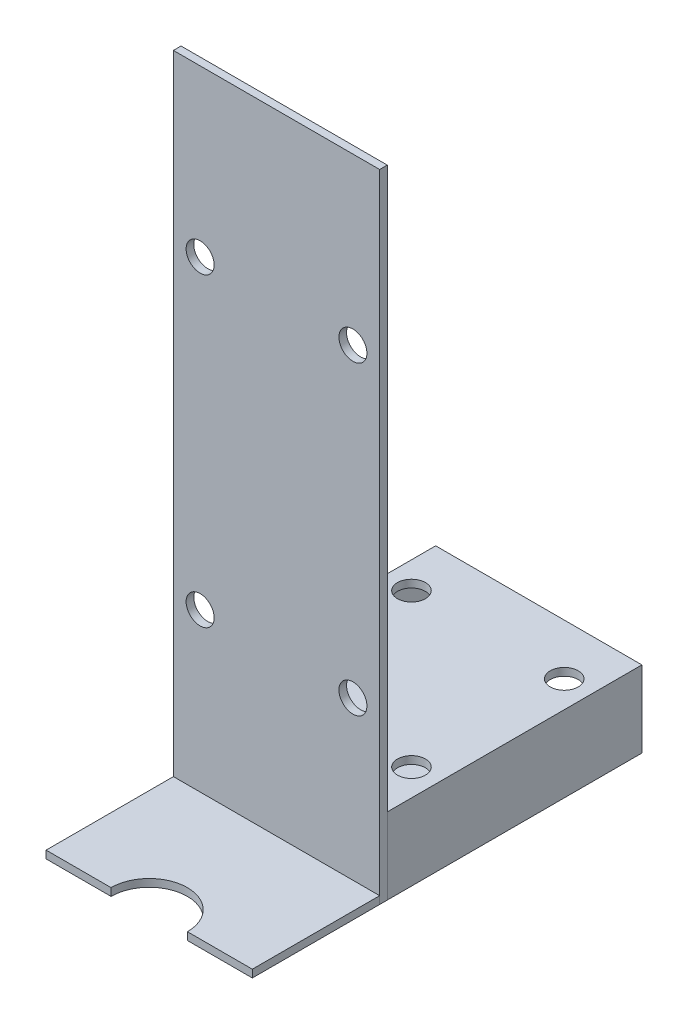
ISO-10303-21;
HEADER;
FILE_DESCRIPTION(('STEP AP214'),'2;1');
FILE_NAME('part.step','',(''),(''),'','','');
FILE_SCHEMA(('AUTOMOTIVE_DESIGN { 1 0 10303 214 1 1 1 1 }'));
ENDSEC;
DATA;
#1=APPLICATION_CONTEXT('core data for automotive mechanical design processes');
#2=APPLICATION_PROTOCOL_DEFINITION('international standard','automotive_design',2000,#1);
#3=PRODUCT_CONTEXT('',#1,'mechanical');
#4=PRODUCT('Part','Part','',(#3));
#5=PRODUCT_RELATED_PRODUCT_CATEGORY('part','',(#4));
#6=PRODUCT_DEFINITION_FORMATION('','',#4);
#7=PRODUCT_DEFINITION_CONTEXT('part definition',#1,'design');
#8=PRODUCT_DEFINITION('design','',#6,#7);
#9=PRODUCT_DEFINITION_SHAPE('','',#8);
#10=(LENGTH_UNIT() NAMED_UNIT(*) SI_UNIT(.MILLI.,.METRE.));
#11=(NAMED_UNIT(*) PLANE_ANGLE_UNIT() SI_UNIT($,.RADIAN.));
#12=(NAMED_UNIT(*) SI_UNIT($,.STERADIAN.) SOLID_ANGLE_UNIT());
#13=UNCERTAINTY_MEASURE_WITH_UNIT(LENGTH_MEASURE(1.E-05),#10,'distance_accuracy_value','');
#14=(GEOMETRIC_REPRESENTATION_CONTEXT(3) GLOBAL_UNCERTAINTY_ASSIGNED_CONTEXT((#13)) GLOBAL_UNIT_ASSIGNED_CONTEXT((#10,
#11,#12)) REPRESENTATION_CONTEXT('',''));
#15=CARTESIAN_POINT('',(0.,0.,0.));
#16=DIRECTION('',(0.,0.,1.));
#17=DIRECTION('',(1.,0.,0.));
#18=AXIS2_PLACEMENT_3D('',#15,#16,#17);
#19=CARTESIAN_POINT('',(0.,0.,76.5));
#20=DIRECTION('',(0.,0.,-1.));
#21=DIRECTION('',(-1.,0.,0.));
#22=AXIS2_PLACEMENT_3D('',#19,#20,#21);
#23=PLANE('',#22);
#24=DIRECTION('',(-1.,0.,0.));
#25=VECTOR('',#24,1.);
#26=CARTESIAN_POINT('',(-1.49999999999999,0.,76.5));
#27=LINE('',#26,#25);
#28=CARTESIAN_POINT('',(39.,0.,76.5));
#29=VERTEX_POINT('',#28);
#30=CARTESIAN_POINT('',(26.25,0.,76.5));
#31=VERTEX_POINT('',#30);
#32=EDGE_CURVE('E145',#29,#31,#27,.T.);
#33=ORIENTED_EDGE('',*,*,#32,.T.);
#34=DIRECTION('',(0.,-1.,0.));
#35=VECTOR('',#34,1.);
#36=CARTESIAN_POINT('',(26.25,23.5,76.5));
#37=LINE('',#36,#35);
#38=CARTESIAN_POINT('',(26.25,-1.5,76.5));
#39=VERTEX_POINT('',#38);
#40=EDGE_CURVE('E13',#31,#39,#37,.T.);
#41=ORIENTED_EDGE('',*,*,#40,.T.);
#42=DIRECTION('',(1.,0.,0.));
#43=VECTOR('',#42,1.);
#44=CARTESIAN_POINT('',(-1.49999999999999,-1.5,76.5));
#45=LINE('',#44,#43);
#46=CARTESIAN_POINT('',(39.,-1.5,76.5));
#47=VERTEX_POINT('',#46);
#48=EDGE_CURVE('E142',#39,#47,#45,.T.);
#49=ORIENTED_EDGE('',*,*,#48,.T.);
#50=DIRECTION('',(0.,1.,0.));
#51=VECTOR('',#50,1.);
#52=CARTESIAN_POINT('',(39.,-1.5,76.5));
#53=LINE('',#52,#51);
#54=EDGE_CURVE('E152',#47,#29,#53,.T.);
#55=ORIENTED_EDGE('',*,*,#54,.T.);
#56=EDGE_LOOP('',(#33,#41,#49,#55));
#57=FACE_BOUND('',#56,.T.);
#58=ADVANCED_FACE('F75',(#57),#23,.F.);
#59=CARTESIAN_POINT('',(-1.49999999999999,-1.5,76.5));
#60=DIRECTION('',(1.,0.,0.));
#61=DIRECTION('',(0.,0.,-1.));
#62=AXIS2_PLACEMENT_3D('',#59,#60,#61);
#63=PLANE('',#62);
#64=DIRECTION('',(0.,-1.,0.));
#65=VECTOR('',#64,1.);
#66=CARTESIAN_POINT('',(-1.49999999999999,-1.5,51.5));
#67=LINE('',#66,#65);
#68=CARTESIAN_POINT('',(-1.49999999999999,0.,51.5));
#69=VERTEX_POINT('',#68);
#70=CARTESIAN_POINT('',(-1.49999999999999,-1.5,51.5));
#71=VERTEX_POINT('',#70);
#72=EDGE_CURVE('E159',#69,#71,#67,.T.);
#73=ORIENTED_EDGE('',*,*,#72,.T.);
#74=DIRECTION('',(0.,0.,-1.));
#75=VECTOR('',#74,1.);
#76=CARTESIAN_POINT('',(-1.49999999999999,-1.5,76.5));
#77=LINE('',#76,#75);
#78=CARTESIAN_POINT('',(-1.49999999999999,-1.5,76.5));
#79=VERTEX_POINT('',#78);
#80=EDGE_CURVE('E171',#79,#71,#77,.T.);
#81=ORIENTED_EDGE('',*,*,#80,.F.);
#82=DIRECTION('',(0.,-1.,0.));
#83=VECTOR('',#82,1.);
#84=CARTESIAN_POINT('',(-1.49999999999999,-1.5,76.5));
#85=LINE('',#84,#83);
#86=CARTESIAN_POINT('',(-1.49999999999999,0.,76.5));
#87=VERTEX_POINT('',#86);
#88=EDGE_CURVE('E150',#87,#79,#85,.T.);
#89=ORIENTED_EDGE('',*,*,#88,.F.);
#90=DIRECTION('',(0.,0.,-1.));
#91=VECTOR('',#90,1.);
#92=CARTESIAN_POINT('',(-1.49999999999999,0.,76.5));
#93=LINE('',#92,#91);
#94=EDGE_CURVE('E158',#87,#69,#93,.T.);
#95=ORIENTED_EDGE('',*,*,#94,.T.);
#96=EDGE_LOOP('',(#73,#81,#89,#95));
#97=FACE_BOUND('',#96,.T.);
#98=ADVANCED_FACE('F77',(#97),#63,.F.);
#99=CARTESIAN_POINT('',(-1.49999999999999,-1.5,76.5));
#100=DIRECTION('',(0.,1.,0.));
#101=DIRECTION('',(0.,0.,1.));
#102=AXIS2_PLACEMENT_3D('',#99,#100,#101);
#103=PLANE('',#102);
#104=ORIENTED_EDGE('',*,*,#48,.F.);
#105=CARTESIAN_POINT('',(18.75,-1.5,76.5));
#106=DIRECTION('',(0.,-1.,0.));
#107=DIRECTION('',(0.,0.,-1.));
#108=AXIS2_PLACEMENT_3D('',#105,#106,#107);
#109=CIRCLE('',#108,7.5);
#110=CARTESIAN_POINT('',(11.25,-1.5,76.5));
#111=VERTEX_POINT('',#110);
#112=EDGE_CURVE('E136',#111,#39,#109,.T.);
#113=ORIENTED_EDGE('',*,*,#112,.F.);
#114=EDGE_CURVE('E128',#79,#111,#45,.T.);
#115=ORIENTED_EDGE('',*,*,#114,.F.);
#116=ORIENTED_EDGE('',*,*,#80,.T.);
#117=DIRECTION('',(1.,0.,0.));
#118=VECTOR('',#117,1.);
#119=CARTESIAN_POINT('',(-1.49999999999999,-1.5,51.5));
#120=LINE('',#119,#118);
#121=CARTESIAN_POINT('',(39.,-1.5,51.5));
#122=VERTEX_POINT('',#121);
#123=EDGE_CURVE('E162',#71,#122,#120,.T.);
#124=ORIENTED_EDGE('',*,*,#123,.T.);
#125=DIRECTION('',(0.,0.,-1.));
#126=VECTOR('',#125,1.);
#127=CARTESIAN_POINT('',(39.,-1.5,76.5));
#128=LINE('',#127,#126);
#129=EDGE_CURVE('E148',#47,#122,#128,.T.);
#130=ORIENTED_EDGE('',*,*,#129,.F.);
#131=EDGE_LOOP('',(#104,#113,#115,#116,#124,#130));
#132=FACE_BOUND('',#131,.T.);
#133=ADVANCED_FACE('F146',(#132),#103,.F.);
#134=CARTESIAN_POINT('',(39.,-1.5,76.5));
#135=DIRECTION('',(-1.,0.,0.));
#136=DIRECTION('',(0.,0.,1.));
#137=AXIS2_PLACEMENT_3D('',#134,#135,#136);
#138=PLANE('',#137);
#139=DIRECTION('',(0.,1.,0.));
#140=VECTOR('',#139,1.);
#141=CARTESIAN_POINT('',(39.,-1.5,51.5));
#142=LINE('',#141,#140);
#143=CARTESIAN_POINT('',(39.,0.,51.5));
#144=VERTEX_POINT('',#143);
#145=EDGE_CURVE('E164',#122,#144,#142,.T.);
#146=ORIENTED_EDGE('',*,*,#145,.T.);
#147=DIRECTION('',(0.,0.,-1.));
#148=VECTOR('',#147,1.);
#149=CARTESIAN_POINT('',(39.,0.,76.5));
#150=LINE('',#149,#148);
#151=EDGE_CURVE('E168',#29,#144,#150,.T.);
#152=ORIENTED_EDGE('',*,*,#151,.F.);
#153=ORIENTED_EDGE('',*,*,#54,.F.);
#154=ORIENTED_EDGE('',*,*,#129,.T.);
#155=EDGE_LOOP('',(#146,#152,#153,#154));
#156=FACE_BOUND('',#155,.T.);
#157=ADVANCED_FACE('F181',(#156),#138,.F.);
#158=CARTESIAN_POINT('',(-1.49999999999999,0.,76.5));
#159=DIRECTION('',(0.,-1.,0.));
#160=DIRECTION('',(0.,0.,-1.));
#161=AXIS2_PLACEMENT_3D('',#158,#159,#160);
#162=PLANE('',#161);
#163=CARTESIAN_POINT('',(11.25,0.,76.5));
#164=VERTEX_POINT('',#163);
#165=EDGE_CURVE('E98',#164,#87,#27,.T.);
#166=ORIENTED_EDGE('',*,*,#165,.F.);
#167=CARTESIAN_POINT('',(18.75,0.,76.5));
#168=DIRECTION('',(0.,-1.,0.));
#169=DIRECTION('',(0.,0.,-1.));
#170=AXIS2_PLACEMENT_3D('',#167,#168,#169);
#171=CIRCLE('',#170,7.5);
#172=EDGE_CURVE('E90',#164,#31,#171,.T.);
#173=ORIENTED_EDGE('',*,*,#172,.T.);
#174=ORIENTED_EDGE('',*,*,#32,.F.);
#175=ORIENTED_EDGE('',*,*,#151,.T.);
#176=DIRECTION('',(-1.,0.,0.));
#177=VECTOR('',#176,1.);
#178=CARTESIAN_POINT('',(-1.49999999999999,0.,51.5));
#179=LINE('',#178,#177);
#180=EDGE_CURVE('E120',#144,#69,#179,.T.);
#181=ORIENTED_EDGE('',*,*,#180,.T.);
#182=ORIENTED_EDGE('',*,*,#94,.F.);
#183=EDGE_LOOP('',(#166,#173,#174,#175,#181,#182));
#184=FACE_BOUND('',#183,.T.);
#185=ADVANCED_FACE('F173',(#184),#162,.F.);
#186=ORIENTED_EDGE('',*,*,#114,.T.);
#187=DIRECTION('',(0.,-1.,0.));
#188=VECTOR('',#187,1.);
#189=CARTESIAN_POINT('',(11.25,23.5,76.5));
#190=LINE('',#189,#188);
#191=EDGE_CURVE('E83',#111,#164,#190,.F.);
#192=ORIENTED_EDGE('',*,*,#191,.T.);
#193=ORIENTED_EDGE('',*,*,#165,.T.);
#194=ORIENTED_EDGE('',*,*,#88,.T.);
#195=EDGE_LOOP('',(#186,#192,#193,#194));
#196=FACE_BOUND('',#195,.T.);
#197=ADVANCED_FACE('F172',(#196),#23,.F.);
#198=CARTESIAN_POINT('',(0.,0.,51.5));
#199=DIRECTION('',(0.,0.,-1.));
#200=DIRECTION('',(-1.,0.,0.));
#201=AXIS2_PLACEMENT_3D('',#198,#199,#200);
#202=PLANE('',#201);
#203=ORIENTED_EDGE('',*,*,#72,.F.);
#204=ORIENTED_EDGE('',*,*,#180,.F.);
#205=ORIENTED_EDGE('',*,*,#145,.F.);
#206=ORIENTED_EDGE('',*,*,#123,.F.);
#207=EDGE_LOOP('',(#203,#204,#205,#206));
#208=FACE_BOUND('',#207,.T.);
#209=ADVANCED_FACE('F183',(#208),#202,.T.);
#210=CARTESIAN_POINT('',(18.75,23.5,76.5));
#211=DIRECTION('',(0.,-1.,0.));
#212=DIRECTION('',(0.,0.,-1.));
#213=AXIS2_PLACEMENT_3D('',#210,#211,#212);
#214=CYLINDRICAL_SURFACE('',#213,7.5);
#215=ORIENTED_EDGE('',*,*,#172,.F.);
#216=ORIENTED_EDGE('',*,*,#191,.F.);
#217=ORIENTED_EDGE('',*,*,#112,.T.);
#218=ORIENTED_EDGE('',*,*,#40,.F.);
#219=EDGE_LOOP('',(#215,#216,#217,#218));
#220=FACE_BOUND('',#219,.T.);
#221=ADVANCED_FACE('F137',(#220),#214,.F.);
#222=CLOSED_SHELL('',(#58,#98,#133,#157,#185,#197,#209,#221));
#223=MANIFOLD_SOLID_BREP('B2',#222);
#224=CARTESIAN_POINT('',(-1.49999999999999,123.5,50.));
#225=DIRECTION('',(1.,0.,0.));
#226=DIRECTION('',(0.,0.,-1.));
#227=AXIS2_PLACEMENT_3D('',#224,#225,#226);
#228=PLANE('',#227);
#229=DIRECTION('',(0.,0.,1.));
#230=VECTOR('',#229,1.);
#231=CARTESIAN_POINT('',(-1.49999999999999,-1.5,50.));
#232=LINE('',#231,#230);
#233=CARTESIAN_POINT('',(-1.49999999999999,-1.5,50.));
#234=VERTEX_POINT('',#233);
#235=CARTESIAN_POINT('',(-1.49999999999999,-1.5,51.5));
#236=VERTEX_POINT('',#235);
#237=EDGE_CURVE('E303',#234,#236,#232,.T.);
#238=ORIENTED_EDGE('',*,*,#237,.T.);
#239=DIRECTION('',(0.,-1.,0.));
#240=VECTOR('',#239,1.);
#241=CARTESIAN_POINT('',(-1.49999999999999,123.5,51.5));
#242=LINE('',#241,#240);
#243=CARTESIAN_POINT('',(-1.49999999999999,123.5,51.5));
#244=VERTEX_POINT('',#243);
#245=EDGE_CURVE('E73',#244,#236,#242,.T.);
#246=ORIENTED_EDGE('',*,*,#245,.F.);
#247=DIRECTION('',(0.,0.,1.));
#248=VECTOR('',#247,1.);
#249=CARTESIAN_POINT('',(-1.49999999999999,123.5,50.));
#250=LINE('',#249,#248);
#251=CARTESIAN_POINT('',(-1.49999999999999,123.5,50.));
#252=VERTEX_POINT('',#251);
#253=EDGE_CURVE('E291',#252,#244,#250,.T.);
#254=ORIENTED_EDGE('',*,*,#253,.F.);
#255=DIRECTION('',(0.,-1.,0.));
#256=VECTOR('',#255,1.);
#257=CARTESIAN_POINT('',(-1.49999999999999,123.5,50.));
#258=LINE('',#257,#256);
#259=EDGE_CURVE('E299',#252,#234,#258,.T.);
#260=ORIENTED_EDGE('',*,*,#259,.T.);
#261=EDGE_LOOP('',(#238,#246,#254,#260));
#262=FACE_BOUND('',#261,.T.);
#263=ADVANCED_FACE('F240',(#262),#228,.F.);
#264=CARTESIAN_POINT('',(-1.49999999999999,123.5,51.5));
#265=DIRECTION('',(0.,0.,-1.));
#266=DIRECTION('',(-1.,0.,0.));
#267=AXIS2_PLACEMENT_3D('',#264,#265,#266);
#268=PLANE('',#267);
#269=CARTESIAN_POINT('',(33.75,91.,51.5));
#270=DIRECTION('',(0.,0.,-1.));
#271=DIRECTION('',(-1.,0.,0.));
#272=AXIS2_PLACEMENT_3D('',#269,#270,#271);
#273=CIRCLE('',#272,2.74999999999999);
#274=CARTESIAN_POINT('',(31.,91.,51.5));
#275=VERTEX_POINT('',#274);
#276=EDGE_CURVE('E334',#275,#275,#273,.T.);
#277=ORIENTED_EDGE('',*,*,#276,.T.);
#278=EDGE_LOOP('',(#277));
#279=FACE_BOUND('',#278,.T.);
#280=CARTESIAN_POINT('',(3.75,31.,51.5));
#281=DIRECTION('',(0.,0.,-1.));
#282=DIRECTION('',(-1.,0.,0.));
#283=AXIS2_PLACEMENT_3D('',#280,#281,#282);
#284=CIRCLE('',#283,2.74999999999999);
#285=CARTESIAN_POINT('',(1.00000000000001,31.,51.5));
#286=VERTEX_POINT('',#285);
#287=EDGE_CURVE('E328',#286,#286,#284,.T.);
#288=ORIENTED_EDGE('',*,*,#287,.T.);
#289=EDGE_LOOP('',(#288));
#290=FACE_BOUND('',#289,.T.);
#291=CARTESIAN_POINT('',(33.75,31.,51.5));
#292=DIRECTION('',(0.,0.,-1.));
#293=DIRECTION('',(-1.,0.,0.));
#294=AXIS2_PLACEMENT_3D('',#291,#292,#293);
#295=CIRCLE('',#294,2.74999999999999);
#296=CARTESIAN_POINT('',(31.,31.,51.5));
#297=VERTEX_POINT('',#296);
#298=EDGE_CURVE('E322',#297,#297,#295,.T.);
#299=ORIENTED_EDGE('',*,*,#298,.T.);
#300=EDGE_LOOP('',(#299));
#301=FACE_BOUND('',#300,.T.);
#302=CARTESIAN_POINT('',(3.75,91.,51.5));
#303=DIRECTION('',(0.,0.,-1.));
#304=DIRECTION('',(-1.,0.,0.));
#305=AXIS2_PLACEMENT_3D('',#302,#303,#304);
#306=CIRCLE('',#305,2.74999999999999);
#307=CARTESIAN_POINT('',(1.00000000000001,91.,51.5));
#308=VERTEX_POINT('',#307);
#309=EDGE_CURVE('E306',#308,#308,#306,.T.);
#310=ORIENTED_EDGE('',*,*,#309,.T.);
#311=EDGE_LOOP('',(#310));
#312=FACE_BOUND('',#311,.T.);
#313=DIRECTION('',(1.,0.,0.));
#314=VECTOR('',#313,1.);
#315=CARTESIAN_POINT('',(-1.49999999999999,-1.5,51.5));
#316=LINE('',#315,#314);
#317=CARTESIAN_POINT('',(39.,-1.5,51.5));
#318=VERTEX_POINT('',#317);
#319=EDGE_CURVE('E295',#236,#318,#316,.T.);
#320=ORIENTED_EDGE('',*,*,#319,.T.);
#321=DIRECTION('',(0.,-1.,0.));
#322=VECTOR('',#321,1.);
#323=CARTESIAN_POINT('',(39.,123.5,51.5));
#324=LINE('',#323,#322);
#325=CARTESIAN_POINT('',(39.,123.5,51.5));
#326=VERTEX_POINT('',#325);
#327=EDGE_CURVE('E248',#326,#318,#324,.T.);
#328=ORIENTED_EDGE('',*,*,#327,.F.);
#329=DIRECTION('',(1.,0.,0.));
#330=VECTOR('',#329,1.);
#331=CARTESIAN_POINT('',(-1.49999999999999,123.5,51.5));
#332=LINE('',#331,#330);
#333=EDGE_CURVE('E286',#244,#326,#332,.T.);
#334=ORIENTED_EDGE('',*,*,#333,.F.);
#335=ORIENTED_EDGE('',*,*,#245,.T.);
#336=EDGE_LOOP('',(#320,#328,#334,#335));
#337=FACE_BOUND('',#336,.T.);
#338=ADVANCED_FACE('F294',(#279,#290,#301,#312,#337),#268,.F.);
#339=CARTESIAN_POINT('',(39.,123.5,50.));
#340=DIRECTION('',(-1.,0.,0.));
#341=DIRECTION('',(0.,0.,1.));
#342=AXIS2_PLACEMENT_3D('',#339,#340,#341);
#343=PLANE('',#342);
#344=DIRECTION('',(0.,0.,-1.));
#345=VECTOR('',#344,1.);
#346=CARTESIAN_POINT('',(39.,-1.5,50.));
#347=LINE('',#346,#345);
#348=CARTESIAN_POINT('',(39.,-1.5,50.));
#349=VERTEX_POINT('',#348);
#350=EDGE_CURVE('E273',#318,#349,#347,.T.);
#351=ORIENTED_EDGE('',*,*,#350,.T.);
#352=DIRECTION('',(0.,-1.,0.));
#353=VECTOR('',#352,1.);
#354=CARTESIAN_POINT('',(39.,123.5,50.));
#355=LINE('',#354,#353);
#356=CARTESIAN_POINT('',(39.,123.5,50.));
#357=VERTEX_POINT('',#356);
#358=EDGE_CURVE('E296',#357,#349,#355,.T.);
#359=ORIENTED_EDGE('',*,*,#358,.F.);
#360=DIRECTION('',(0.,0.,-1.));
#361=VECTOR('',#360,1.);
#362=CARTESIAN_POINT('',(39.,123.5,50.));
#363=LINE('',#362,#361);
#364=EDGE_CURVE('E289',#326,#357,#363,.T.);
#365=ORIENTED_EDGE('',*,*,#364,.F.);
#366=ORIENTED_EDGE('',*,*,#327,.T.);
#367=EDGE_LOOP('',(#351,#359,#365,#366));
#368=FACE_BOUND('',#367,.T.);
#369=ADVANCED_FACE('F297',(#368),#343,.F.);
#370=CARTESIAN_POINT('',(-1.49999999999999,123.5,50.));
#371=DIRECTION('',(0.,0.,1.));
#372=DIRECTION('',(1.,0.,0.));
#373=AXIS2_PLACEMENT_3D('',#370,#371,#372);
#374=PLANE('',#373);
#375=CARTESIAN_POINT('',(33.75,91.,50.));
#376=DIRECTION('',(0.,0.,-1.));
#377=DIRECTION('',(-1.,0.,0.));
#378=AXIS2_PLACEMENT_3D('',#375,#376,#377);
#379=CIRCLE('',#378,2.74999999999999);
#380=CARTESIAN_POINT('',(31.,91.,50.));
#381=VERTEX_POINT('',#380);
#382=EDGE_CURVE('E337',#381,#381,#379,.T.);
#383=ORIENTED_EDGE('',*,*,#382,.F.);
#384=EDGE_LOOP('',(#383));
#385=FACE_BOUND('',#384,.T.);
#386=CARTESIAN_POINT('',(3.75,31.,50.));
#387=DIRECTION('',(0.,0.,-1.));
#388=DIRECTION('',(-1.,0.,0.));
#389=AXIS2_PLACEMENT_3D('',#386,#387,#388);
#390=CIRCLE('',#389,2.74999999999999);
#391=CARTESIAN_POINT('',(1.00000000000001,31.,50.));
#392=VERTEX_POINT('',#391);
#393=EDGE_CURVE('E331',#392,#392,#390,.T.);
#394=ORIENTED_EDGE('',*,*,#393,.F.);
#395=EDGE_LOOP('',(#394));
#396=FACE_BOUND('',#395,.T.);
#397=CARTESIAN_POINT('',(33.75,31.,50.));
#398=DIRECTION('',(0.,0.,-1.));
#399=DIRECTION('',(-1.,0.,0.));
#400=AXIS2_PLACEMENT_3D('',#397,#398,#399);
#401=CIRCLE('',#400,2.74999999999999);
#402=CARTESIAN_POINT('',(31.,31.,50.));
#403=VERTEX_POINT('',#402);
#404=EDGE_CURVE('E325',#403,#403,#401,.T.);
#405=ORIENTED_EDGE('',*,*,#404,.F.);
#406=EDGE_LOOP('',(#405));
#407=FACE_BOUND('',#406,.T.);
#408=CARTESIAN_POINT('',(3.75,91.,50.));
#409=DIRECTION('',(0.,0.,-1.));
#410=DIRECTION('',(-1.,0.,0.));
#411=AXIS2_PLACEMENT_3D('',#408,#409,#410);
#412=CIRCLE('',#411,2.74999999999999);
#413=CARTESIAN_POINT('',(1.00000000000001,91.,50.));
#414=VERTEX_POINT('',#413);
#415=EDGE_CURVE('E319',#414,#414,#412,.T.);
#416=ORIENTED_EDGE('',*,*,#415,.F.);
#417=EDGE_LOOP('',(#416));
#418=FACE_BOUND('',#417,.T.);
#419=DIRECTION('',(-1.,0.,0.));
#420=VECTOR('',#419,1.);
#421=CARTESIAN_POINT('',(-1.49999999999999,-1.5,50.));
#422=LINE('',#421,#420);
#423=EDGE_CURVE('E279',#349,#234,#422,.T.);
#424=ORIENTED_EDGE('',*,*,#423,.T.);
#425=ORIENTED_EDGE('',*,*,#259,.F.);
#426=DIRECTION('',(-1.,0.,0.));
#427=VECTOR('',#426,1.);
#428=CARTESIAN_POINT('',(-1.49999999999999,123.5,50.));
#429=LINE('',#428,#427);
#430=EDGE_CURVE('E256',#357,#252,#429,.T.);
#431=ORIENTED_EDGE('',*,*,#430,.F.);
#432=ORIENTED_EDGE('',*,*,#358,.T.);
#433=EDGE_LOOP('',(#424,#425,#431,#432));
#434=FACE_BOUND('',#433,.T.);
#435=ADVANCED_FACE('F311',(#385,#396,#407,#418,#434),#374,.F.);
#436=CARTESIAN_POINT('',(0.,123.5,0.));
#437=DIRECTION('',(0.,1.,0.));
#438=DIRECTION('',(0.,0.,1.));
#439=AXIS2_PLACEMENT_3D('',#436,#437,#438);
#440=PLANE('',#439);
#441=ORIENTED_EDGE('',*,*,#253,.T.);
#442=ORIENTED_EDGE('',*,*,#333,.T.);
#443=ORIENTED_EDGE('',*,*,#364,.T.);
#444=ORIENTED_EDGE('',*,*,#430,.T.);
#445=EDGE_LOOP('',(#441,#442,#443,#444));
#446=FACE_BOUND('',#445,.T.);
#447=ADVANCED_FACE('F287',(#446),#440,.T.);
#448=CARTESIAN_POINT('',(0.,-1.5,0.));
#449=DIRECTION('',(0.,1.,0.));
#450=DIRECTION('',(0.,0.,1.));
#451=AXIS2_PLACEMENT_3D('',#448,#449,#450);
#452=PLANE('',#451);
#453=ORIENTED_EDGE('',*,*,#237,.F.);
#454=ORIENTED_EDGE('',*,*,#423,.F.);
#455=ORIENTED_EDGE('',*,*,#350,.F.);
#456=ORIENTED_EDGE('',*,*,#319,.F.);
#457=EDGE_LOOP('',(#453,#454,#455,#456));
#458=FACE_BOUND('',#457,.T.);
#459=ADVANCED_FACE('F314',(#458),#452,.F.);
#460=CARTESIAN_POINT('',(3.75,91.,50.));
#461=DIRECTION('',(0.,0.,-1.));
#462=DIRECTION('',(-1.,0.,0.));
#463=AXIS2_PLACEMENT_3D('',#460,#461,#462);
#464=CYLINDRICAL_SURFACE('',#463,2.74999999999999);
#465=ORIENTED_EDGE('',*,*,#415,.T.);
#466=EDGE_LOOP('',(#465));
#467=FACE_BOUND('',#466,.T.);
#468=ORIENTED_EDGE('',*,*,#309,.F.);
#469=EDGE_LOOP('',(#468));
#470=FACE_BOUND('',#469,.T.);
#471=ADVANCED_FACE('F353',(#467,#470),#464,.F.);
#472=CARTESIAN_POINT('',(33.75,31.,50.));
#473=DIRECTION('',(0.,0.,-1.));
#474=DIRECTION('',(-1.,0.,0.));
#475=AXIS2_PLACEMENT_3D('',#472,#473,#474);
#476=CYLINDRICAL_SURFACE('',#475,2.74999999999999);
#477=ORIENTED_EDGE('',*,*,#404,.T.);
#478=EDGE_LOOP('',(#477));
#479=FACE_BOUND('',#478,.T.);
#480=ORIENTED_EDGE('',*,*,#298,.F.);
#481=EDGE_LOOP('',(#480));
#482=FACE_BOUND('',#481,.T.);
#483=ADVANCED_FACE('F356',(#479,#482),#476,.F.);
#484=CARTESIAN_POINT('',(3.75,31.,50.));
#485=DIRECTION('',(0.,0.,-1.));
#486=DIRECTION('',(-1.,0.,0.));
#487=AXIS2_PLACEMENT_3D('',#484,#485,#486);
#488=CYLINDRICAL_SURFACE('',#487,2.74999999999999);
#489=ORIENTED_EDGE('',*,*,#393,.T.);
#490=EDGE_LOOP('',(#489));
#491=FACE_BOUND('',#490,.T.);
#492=ORIENTED_EDGE('',*,*,#287,.F.);
#493=EDGE_LOOP('',(#492));
#494=FACE_BOUND('',#493,.T.);
#495=ADVANCED_FACE('F375',(#491,#494),#488,.F.);
#496=CARTESIAN_POINT('',(33.75,91.,50.));
#497=DIRECTION('',(0.,0.,-1.));
#498=DIRECTION('',(-1.,0.,0.));
#499=AXIS2_PLACEMENT_3D('',#496,#497,#498);
#500=CYLINDRICAL_SURFACE('',#499,2.74999999999999);
#501=ORIENTED_EDGE('',*,*,#382,.T.);
#502=EDGE_LOOP('',(#501));
#503=FACE_BOUND('',#502,.T.);
#504=ORIENTED_EDGE('',*,*,#276,.F.);
#505=EDGE_LOOP('',(#504));
#506=FACE_BOUND('',#505,.T.);
#507=ADVANCED_FACE('F341',(#503,#506),#500,.F.);
#508=CLOSED_SHELL('',(#263,#338,#369,#435,#447,#459,#471,#483,#495,#507));
#509=MANIFOLD_SOLID_BREP('B7',#508);
#510=CARTESIAN_POINT('',(0.,0.,50.));
#511=DIRECTION('',(0.,0.,1.));
#512=DIRECTION('',(1.,0.,0.));
#513=AXIS2_PLACEMENT_3D('',#510,#511,#512);
#514=PLANE('',#513);
#515=DIRECTION('',(0.,-1.,0.));
#516=VECTOR('',#515,1.);
#517=CARTESIAN_POINT('',(-1.5,0.,50.));
#518=LINE('',#517,#516);
#519=CARTESIAN_POINT('',(-1.49999999999999,13.5,50.));
#520=VERTEX_POINT('',#519);
#521=CARTESIAN_POINT('',(-1.5,-1.5,50.));
#522=VERTEX_POINT('',#521);
#523=EDGE_CURVE('E532',#520,#522,#518,.T.);
#524=ORIENTED_EDGE('',*,*,#523,.T.);
#525=DIRECTION('',(1.,0.,0.));
#526=VECTOR('',#525,1.);
#527=CARTESIAN_POINT('',(0.,-1.5,50.));
#528=LINE('',#527,#526);
#529=CARTESIAN_POINT('',(39.,-1.5,50.));
#530=VERTEX_POINT('',#529);
#531=EDGE_CURVE('E535',#522,#530,#528,.T.);
#532=ORIENTED_EDGE('',*,*,#531,.T.);
#533=DIRECTION('',(0.,1.,0.));
#534=VECTOR('',#533,1.);
#535=CARTESIAN_POINT('',(39.,0.,50.));
#536=LINE('',#535,#534);
#537=CARTESIAN_POINT('',(39.,13.5,50.));
#538=VERTEX_POINT('',#537);
#539=EDGE_CURVE('E538',#530,#538,#536,.T.);
#540=ORIENTED_EDGE('',*,*,#539,.T.);
#541=DIRECTION('',(-1.,0.,0.));
#542=VECTOR('',#541,1.);
#543=CARTESIAN_POINT('',(0.,13.5,50.));
#544=LINE('',#543,#542);
#545=EDGE_CURVE('E540',#538,#520,#544,.T.);
#546=ORIENTED_EDGE('',*,*,#545,.T.);
#547=EDGE_LOOP('',(#524,#532,#540,#546));
#548=FACE_BOUND('',#547,.T.);
#549=DIRECTION('',(1.,0.,0.));
#550=VECTOR('',#549,1.);
#551=CARTESIAN_POINT('',(0.,0.,50.));
#552=LINE('',#551,#550);
#553=CARTESIAN_POINT('',(0.,0.,50.));
#554=VERTEX_POINT('',#553);
#555=CARTESIAN_POINT('',(37.5,0.,50.));
#556=VERTEX_POINT('',#555);
#557=EDGE_CURVE('E502',#554,#556,#552,.T.);
#558=ORIENTED_EDGE('',*,*,#557,.F.);
#559=DIRECTION('',(0.,-1.,0.));
#560=VECTOR('',#559,1.);
#561=CARTESIAN_POINT('',(0.,0.,50.));
#562=LINE('',#561,#560);
#563=CARTESIAN_POINT('',(0.,12.,50.));
#564=VERTEX_POINT('',#563);
#565=EDGE_CURVE('E494',#564,#554,#562,.T.);
#566=ORIENTED_EDGE('',*,*,#565,.F.);
#567=DIRECTION('',(-1.,0.,0.));
#568=VECTOR('',#567,1.);
#569=CARTESIAN_POINT('',(0.,12.,50.));
#570=LINE('',#569,#568);
#571=CARTESIAN_POINT('',(37.5,12.,50.));
#572=VERTEX_POINT('',#571);
#573=EDGE_CURVE('E516',#572,#564,#570,.T.);
#574=ORIENTED_EDGE('',*,*,#573,.F.);
#575=DIRECTION('',(0.,1.,0.));
#576=VECTOR('',#575,1.);
#577=CARTESIAN_POINT('',(37.5,0.,50.));
#578=LINE('',#577,#576);
#579=EDGE_CURVE('E514',#556,#572,#578,.T.);
#580=ORIENTED_EDGE('',*,*,#579,.F.);
#581=EDGE_LOOP('',(#558,#566,#574,#580));
#582=FACE_BOUND('',#581,.T.);
#583=ADVANCED_FACE('F427',(#548,#582),#514,.T.);
#584=CARTESIAN_POINT('',(0.,0.,0.));
#585=DIRECTION('',(0.,0.,1.));
#586=DIRECTION('',(1.,0.,0.));
#587=AXIS2_PLACEMENT_3D('',#584,#585,#586);
#588=PLANE('',#587);
#589=DIRECTION('',(0.,-1.,0.));
#590=VECTOR('',#589,1.);
#591=CARTESIAN_POINT('',(-1.5,0.,0.));
#592=LINE('',#591,#590);
#593=CARTESIAN_POINT('',(-1.49999999999999,13.5,0.));
#594=VERTEX_POINT('',#593);
#595=CARTESIAN_POINT('',(-1.5,-1.5,0.));
#596=VERTEX_POINT('',#595);
#597=EDGE_CURVE('E510',#594,#596,#592,.T.);
#598=ORIENTED_EDGE('',*,*,#597,.F.);
#599=DIRECTION('',(-1.,0.,0.));
#600=VECTOR('',#599,1.);
#601=CARTESIAN_POINT('',(0.,13.5,0.));
#602=LINE('',#601,#600);
#603=CARTESIAN_POINT('',(39.,13.5,0.));
#604=VERTEX_POINT('',#603);
#605=EDGE_CURVE('E536',#604,#594,#602,.T.);
#606=ORIENTED_EDGE('',*,*,#605,.F.);
#607=DIRECTION('',(0.,1.,0.));
#608=VECTOR('',#607,1.);
#609=CARTESIAN_POINT('',(39.,0.,0.));
#610=LINE('',#609,#608);
#611=CARTESIAN_POINT('',(39.,-1.5,0.));
#612=VERTEX_POINT('',#611);
#613=EDGE_CURVE('E547',#612,#604,#610,.T.);
#614=ORIENTED_EDGE('',*,*,#613,.F.);
#615=DIRECTION('',(1.,0.,0.));
#616=VECTOR('',#615,1.);
#617=CARTESIAN_POINT('',(0.,-1.5,0.));
#618=LINE('',#617,#616);
#619=EDGE_CURVE('E545',#596,#612,#618,.T.);
#620=ORIENTED_EDGE('',*,*,#619,.F.);
#621=EDGE_LOOP('',(#598,#606,#614,#620));
#622=FACE_BOUND('',#621,.T.);
#623=DIRECTION('',(0.,-1.,0.));
#624=VECTOR('',#623,1.);
#625=CARTESIAN_POINT('',(0.,0.,0.));
#626=LINE('',#625,#624);
#627=CARTESIAN_POINT('',(0.,12.,0.));
#628=VERTEX_POINT('',#627);
#629=CARTESIAN_POINT('',(0.,0.,0.));
#630=VERTEX_POINT('',#629);
#631=EDGE_CURVE('E452',#628,#630,#626,.T.);
#632=ORIENTED_EDGE('',*,*,#631,.T.);
#633=DIRECTION('',(1.,0.,0.));
#634=VECTOR('',#633,1.);
#635=CARTESIAN_POINT('',(0.,0.,0.));
#636=LINE('',#635,#634);
#637=CARTESIAN_POINT('',(37.5,0.,0.));
#638=VERTEX_POINT('',#637);
#639=EDGE_CURVE('E509',#630,#638,#636,.T.);
#640=ORIENTED_EDGE('',*,*,#639,.T.);
#641=DIRECTION('',(0.,1.,0.));
#642=VECTOR('',#641,1.);
#643=CARTESIAN_POINT('',(37.5,0.,0.));
#644=LINE('',#643,#642);
#645=CARTESIAN_POINT('',(37.5,12.,0.));
#646=VERTEX_POINT('',#645);
#647=EDGE_CURVE('E524',#638,#646,#644,.T.);
#648=ORIENTED_EDGE('',*,*,#647,.T.);
#649=DIRECTION('',(-1.,0.,0.));
#650=VECTOR('',#649,1.);
#651=CARTESIAN_POINT('',(0.,12.,0.));
#652=LINE('',#651,#650);
#653=EDGE_CURVE('E503',#646,#628,#652,.T.);
#654=ORIENTED_EDGE('',*,*,#653,.T.);
#655=EDGE_LOOP('',(#632,#640,#648,#654));
#656=FACE_BOUND('',#655,.T.);
#657=ADVANCED_FACE('F616',(#622,#656),#588,.F.);
#658=CARTESIAN_POINT('',(-1.5,0.,50.));
#659=DIRECTION('',(1.,0.,0.));
#660=DIRECTION('',(0.,1.,0.));
#661=AXIS2_PLACEMENT_3D('',#658,#659,#660);
#662=PLANE('',#661);
#663=ORIENTED_EDGE('',*,*,#597,.T.);
#664=DIRECTION('',(0.,0.,-1.));
#665=VECTOR('',#664,1.);
#666=CARTESIAN_POINT('',(-1.5,-1.5,50.));
#667=LINE('',#666,#665);
#668=EDGE_CURVE('E238',#522,#596,#667,.T.);
#669=ORIENTED_EDGE('',*,*,#668,.F.);
#670=ORIENTED_EDGE('',*,*,#523,.F.);
#671=DIRECTION('',(0.,0.,-1.));
#672=VECTOR('',#671,1.);
#673=CARTESIAN_POINT('',(-1.49999999999999,13.5,50.));
#674=LINE('',#673,#672);
#675=EDGE_CURVE('E542',#520,#594,#674,.T.);
#676=ORIENTED_EDGE('',*,*,#675,.T.);
#677=EDGE_LOOP('',(#663,#669,#670,#676));
#678=FACE_BOUND('',#677,.T.);
#679=ADVANCED_FACE('F429',(#678),#662,.F.);
#680=CARTESIAN_POINT('',(0.,-1.5,50.));
#681=DIRECTION('',(0.,1.,0.));
#682=DIRECTION('',(0.,0.,1.));
#683=AXIS2_PLACEMENT_3D('',#680,#681,#682);
#684=PLANE('',#683);
#685=CARTESIAN_POINT('',(3.75000000000001,-1.5,10.));
#686=DIRECTION('',(0.,1.,0.));
#687=DIRECTION('',(0.,0.,1.));
#688=AXIS2_PLACEMENT_3D('',#685,#686,#687);
#689=CIRCLE('',#688,2.75);
#690=CARTESIAN_POINT('',(3.75000000000001,-1.5,12.75));
#691=VERTEX_POINT('',#690);
#692=EDGE_CURVE('E640',#691,#691,#689,.T.);
#693=ORIENTED_EDGE('',*,*,#692,.T.);
#694=EDGE_LOOP('',(#693));
#695=FACE_BOUND('',#694,.T.);
#696=CARTESIAN_POINT('',(33.75,-1.5,40.));
#697=DIRECTION('',(0.,1.,0.));
#698=DIRECTION('',(0.,0.,1.));
#699=AXIS2_PLACEMENT_3D('',#696,#697,#698);
#700=CIRCLE('',#699,2.75);
#701=CARTESIAN_POINT('',(33.75,-1.5,42.75));
#702=VERTEX_POINT('',#701);
#703=EDGE_CURVE('E568',#702,#702,#700,.T.);
#704=ORIENTED_EDGE('',*,*,#703,.T.);
#705=EDGE_LOOP('',(#704));
#706=FACE_BOUND('',#705,.T.);
#707=CARTESIAN_POINT('',(3.75000000000001,-1.5,40.));
#708=DIRECTION('',(0.,1.,0.));
#709=DIRECTION('',(0.,0.,1.));
#710=AXIS2_PLACEMENT_3D('',#707,#708,#709);
#711=CIRCLE('',#710,2.75);
#712=CARTESIAN_POINT('',(3.75000000000001,-1.5,42.75));
#713=VERTEX_POINT('',#712);
#714=EDGE_CURVE('E564',#713,#713,#711,.T.);
#715=ORIENTED_EDGE('',*,*,#714,.T.);
#716=EDGE_LOOP('',(#715));
#717=FACE_BOUND('',#716,.T.);
#718=CARTESIAN_POINT('',(33.75,-1.5,10.));
#719=DIRECTION('',(0.,1.,0.));
#720=DIRECTION('',(0.,0.,1.));
#721=AXIS2_PLACEMENT_3D('',#718,#719,#720);
#722=CIRCLE('',#721,2.75);
#723=CARTESIAN_POINT('',(33.75,-1.5,12.75));
#724=VERTEX_POINT('',#723);
#725=EDGE_CURVE('E560',#724,#724,#722,.T.);
#726=ORIENTED_EDGE('',*,*,#725,.T.);
#727=EDGE_LOOP('',(#726));
#728=FACE_BOUND('',#727,.T.);
#729=ORIENTED_EDGE('',*,*,#619,.T.);
#730=DIRECTION('',(0.,0.,-1.));
#731=VECTOR('',#730,1.);
#732=CARTESIAN_POINT('',(39.,-1.5,50.));
#733=LINE('',#732,#731);
#734=EDGE_CURVE('E436',#530,#612,#733,.T.);
#735=ORIENTED_EDGE('',*,*,#734,.F.);
#736=ORIENTED_EDGE('',*,*,#531,.F.);
#737=ORIENTED_EDGE('',*,*,#668,.T.);
#738=EDGE_LOOP('',(#729,#735,#736,#737));
#739=FACE_BOUND('',#738,.T.);
#740=ADVANCED_FACE('F630',(#695,#706,#717,#728,#739),#684,.F.);
#741=CARTESIAN_POINT('',(39.,0.,50.));
#742=DIRECTION('',(-1.,0.,0.));
#743=DIRECTION('',(0.,-1.,0.));
#744=AXIS2_PLACEMENT_3D('',#741,#742,#743);
#745=PLANE('',#744);
#746=ORIENTED_EDGE('',*,*,#613,.T.);
#747=DIRECTION('',(0.,0.,-1.));
#748=VECTOR('',#747,1.);
#749=CARTESIAN_POINT('',(39.,13.5,50.));
#750=LINE('',#749,#748);
#751=EDGE_CURVE('E552',#538,#604,#750,.T.);
#752=ORIENTED_EDGE('',*,*,#751,.F.);
#753=ORIENTED_EDGE('',*,*,#539,.F.);
#754=ORIENTED_EDGE('',*,*,#734,.T.);
#755=EDGE_LOOP('',(#746,#752,#753,#754));
#756=FACE_BOUND('',#755,.T.);
#757=ADVANCED_FACE('F627',(#756),#745,.F.);
#758=CARTESIAN_POINT('',(0.,13.5,50.));
#759=DIRECTION('',(0.,-1.,0.));
#760=DIRECTION('',(0.,0.,-1.));
#761=AXIS2_PLACEMENT_3D('',#758,#759,#760);
#762=PLANE('',#761);
#763=CARTESIAN_POINT('',(3.75000000000001,13.5,10.));
#764=DIRECTION('',(0.,1.,0.));
#765=DIRECTION('',(0.,0.,1.));
#766=AXIS2_PLACEMENT_3D('',#763,#764,#765);
#767=CIRCLE('',#766,2.74999999999999);
#768=CARTESIAN_POINT('',(3.75000000000001,13.5,12.75));
#769=VERTEX_POINT('',#768);
#770=EDGE_CURVE('E694',#769,#769,#767,.T.);
#771=ORIENTED_EDGE('',*,*,#770,.F.);
#772=EDGE_LOOP('',(#771));
#773=FACE_BOUND('',#772,.T.);
#774=CARTESIAN_POINT('',(33.75,13.5,40.));
#775=DIRECTION('',(0.,1.,0.));
#776=DIRECTION('',(0.,0.,1.));
#777=AXIS2_PLACEMENT_3D('',#774,#775,#776);
#778=CIRCLE('',#777,2.74999999999999);
#779=CARTESIAN_POINT('',(33.75,13.5,42.75));
#780=VERTEX_POINT('',#779);
#781=EDGE_CURVE('E575',#780,#780,#778,.T.);
#782=ORIENTED_EDGE('',*,*,#781,.F.);
#783=EDGE_LOOP('',(#782));
#784=FACE_BOUND('',#783,.T.);
#785=CARTESIAN_POINT('',(3.75000000000001,13.5,40.));
#786=DIRECTION('',(0.,1.,0.));
#787=DIRECTION('',(0.,0.,1.));
#788=AXIS2_PLACEMENT_3D('',#785,#786,#787);
#789=CIRCLE('',#788,2.74999999999999);
#790=CARTESIAN_POINT('',(3.75000000000001,13.5,42.75));
#791=VERTEX_POINT('',#790);
#792=EDGE_CURVE('E572',#791,#791,#789,.T.);
#793=ORIENTED_EDGE('',*,*,#792,.F.);
#794=EDGE_LOOP('',(#793));
#795=FACE_BOUND('',#794,.T.);
#796=CARTESIAN_POINT('',(33.75,13.5,10.));
#797=DIRECTION('',(0.,1.,0.));
#798=DIRECTION('',(0.,0.,1.));
#799=AXIS2_PLACEMENT_3D('',#796,#797,#798);
#800=CIRCLE('',#799,2.74999999999999);
#801=CARTESIAN_POINT('',(33.75,13.5,12.75));
#802=VERTEX_POINT('',#801);
#803=EDGE_CURVE('E590',#802,#802,#800,.T.);
#804=ORIENTED_EDGE('',*,*,#803,.F.);
#805=EDGE_LOOP('',(#804));
#806=FACE_BOUND('',#805,.T.);
#807=ORIENTED_EDGE('',*,*,#605,.T.);
#808=ORIENTED_EDGE('',*,*,#675,.F.);
#809=ORIENTED_EDGE('',*,*,#545,.F.);
#810=ORIENTED_EDGE('',*,*,#751,.T.);
#811=EDGE_LOOP('',(#807,#808,#809,#810));
#812=FACE_BOUND('',#811,.T.);
#813=ADVANCED_FACE('F611',(#773,#784,#795,#806,#812),#762,.F.);
#814=CARTESIAN_POINT('',(0.,0.,50.));
#815=DIRECTION('',(1.,0.,0.));
#816=DIRECTION('',(0.,1.,0.));
#817=AXIS2_PLACEMENT_3D('',#814,#815,#816);
#818=PLANE('',#817);
#819=ORIENTED_EDGE('',*,*,#631,.F.);
#820=DIRECTION('',(0.,0.,-1.));
#821=VECTOR('',#820,1.);
#822=CARTESIAN_POINT('',(0.,12.,50.));
#823=LINE('',#822,#821);
#824=EDGE_CURVE('E498',#564,#628,#823,.T.);
#825=ORIENTED_EDGE('',*,*,#824,.F.);
#826=ORIENTED_EDGE('',*,*,#565,.T.);
#827=DIRECTION('',(0.,0.,-1.));
#828=VECTOR('',#827,1.);
#829=CARTESIAN_POINT('',(0.,0.,50.));
#830=LINE('',#829,#828);
#831=EDGE_CURVE('E497',#554,#630,#830,.T.);
#832=ORIENTED_EDGE('',*,*,#831,.T.);
#833=EDGE_LOOP('',(#819,#825,#826,#832));
#834=FACE_BOUND('',#833,.T.);
#835=ADVANCED_FACE('F496',(#834),#818,.T.);
#836=CARTESIAN_POINT('',(0.,0.,50.));
#837=DIRECTION('',(0.,1.,0.));
#838=DIRECTION('',(0.,0.,1.));
#839=AXIS2_PLACEMENT_3D('',#836,#837,#838);
#840=PLANE('',#839);
#841=CARTESIAN_POINT('',(3.75000000000001,0.,10.));
#842=DIRECTION('',(0.,1.,0.));
#843=DIRECTION('',(0.,0.,1.));
#844=AXIS2_PLACEMENT_3D('',#841,#842,#843);
#845=CIRCLE('',#844,2.74999999999999);
#846=CARTESIAN_POINT('',(3.75000000000001,0.,12.75));
#847=VERTEX_POINT('',#846);
#848=EDGE_CURVE('E580',#847,#847,#845,.T.);
#849=ORIENTED_EDGE('',*,*,#848,.F.);
#850=EDGE_LOOP('',(#849));
#851=FACE_BOUND('',#850,.T.);
#852=CARTESIAN_POINT('',(33.75,0.,40.));
#853=DIRECTION('',(0.,1.,0.));
#854=DIRECTION('',(0.,0.,1.));
#855=AXIS2_PLACEMENT_3D('',#852,#853,#854);
#856=CIRCLE('',#855,2.74999999999999);
#857=CARTESIAN_POINT('',(33.75,0.,42.75));
#858=VERTEX_POINT('',#857);
#859=EDGE_CURVE('E567',#858,#858,#856,.T.);
#860=ORIENTED_EDGE('',*,*,#859,.F.);
#861=EDGE_LOOP('',(#860));
#862=FACE_BOUND('',#861,.T.);
#863=CARTESIAN_POINT('',(3.75000000000001,0.,40.));
#864=DIRECTION('',(0.,1.,0.));
#865=DIRECTION('',(0.,0.,1.));
#866=AXIS2_PLACEMENT_3D('',#863,#864,#865);
#867=CIRCLE('',#866,2.74999999999999);
#868=CARTESIAN_POINT('',(3.75000000000001,0.,42.75));
#869=VERTEX_POINT('',#868);
#870=EDGE_CURVE('E563',#869,#869,#867,.T.);
#871=ORIENTED_EDGE('',*,*,#870,.F.);
#872=EDGE_LOOP('',(#871));
#873=FACE_BOUND('',#872,.T.);
#874=CARTESIAN_POINT('',(33.75,0.,10.));
#875=DIRECTION('',(0.,1.,0.));
#876=DIRECTION('',(0.,0.,1.));
#877=AXIS2_PLACEMENT_3D('',#874,#875,#876);
#878=CIRCLE('',#877,2.74999999999999);
#879=CARTESIAN_POINT('',(33.75,0.,12.75));
#880=VERTEX_POINT('',#879);
#881=EDGE_CURVE('E522',#880,#880,#878,.T.);
#882=ORIENTED_EDGE('',*,*,#881,.F.);
#883=EDGE_LOOP('',(#882));
#884=FACE_BOUND('',#883,.T.);
#885=ORIENTED_EDGE('',*,*,#639,.F.);
#886=ORIENTED_EDGE('',*,*,#831,.F.);
#887=ORIENTED_EDGE('',*,*,#557,.T.);
#888=DIRECTION('',(0.,0.,-1.));
#889=VECTOR('',#888,1.);
#890=CARTESIAN_POINT('',(37.5,0.,50.));
#891=LINE('',#890,#889);
#892=EDGE_CURVE('E511',#556,#638,#891,.T.);
#893=ORIENTED_EDGE('',*,*,#892,.T.);
#894=EDGE_LOOP('',(#885,#886,#887,#893));
#895=FACE_BOUND('',#894,.T.);
#896=ADVANCED_FACE('F506',(#851,#862,#873,#884,#895),#840,.T.);
#897=CARTESIAN_POINT('',(37.5,0.,50.));
#898=DIRECTION('',(-1.,0.,0.));
#899=DIRECTION('',(0.,-1.,0.));
#900=AXIS2_PLACEMENT_3D('',#897,#898,#899);
#901=PLANE('',#900);
#902=ORIENTED_EDGE('',*,*,#647,.F.);
#903=ORIENTED_EDGE('',*,*,#892,.F.);
#904=ORIENTED_EDGE('',*,*,#579,.T.);
#905=DIRECTION('',(0.,0.,-1.));
#906=VECTOR('',#905,1.);
#907=CARTESIAN_POINT('',(37.5,12.,50.));
#908=LINE('',#907,#906);
#909=EDGE_CURVE('E444',#572,#646,#908,.T.);
#910=ORIENTED_EDGE('',*,*,#909,.T.);
#911=EDGE_LOOP('',(#902,#903,#904,#910));
#912=FACE_BOUND('',#911,.T.);
#913=ADVANCED_FACE('F601',(#912),#901,.T.);
#914=CARTESIAN_POINT('',(0.,12.,50.));
#915=DIRECTION('',(0.,-1.,0.));
#916=DIRECTION('',(0.,0.,-1.));
#917=AXIS2_PLACEMENT_3D('',#914,#915,#916);
#918=PLANE('',#917);
#919=CARTESIAN_POINT('',(3.75000000000001,12.,10.));
#920=DIRECTION('',(0.,-1.,0.));
#921=DIRECTION('',(0.,0.,-1.));
#922=AXIS2_PLACEMENT_3D('',#919,#920,#921);
#923=CIRCLE('',#922,2.74999999999999);
#924=CARTESIAN_POINT('',(3.75000000000001,12.,7.25000000000001));
#925=VERTEX_POINT('',#924);
#926=EDGE_CURVE('E431',#925,#925,#923,.T.);
#927=ORIENTED_EDGE('',*,*,#926,.F.);
#928=EDGE_LOOP('',(#927));
#929=FACE_BOUND('',#928,.T.);
#930=CARTESIAN_POINT('',(33.75,12.,40.));
#931=DIRECTION('',(0.,-1.,0.));
#932=DIRECTION('',(0.,0.,-1.));
#933=AXIS2_PLACEMENT_3D('',#930,#931,#932);
#934=CIRCLE('',#933,2.74999999999999);
#935=CARTESIAN_POINT('',(33.75,12.,37.25));
#936=VERTEX_POINT('',#935);
#937=EDGE_CURVE('E565',#936,#936,#934,.T.);
#938=ORIENTED_EDGE('',*,*,#937,.F.);
#939=EDGE_LOOP('',(#938));
#940=FACE_BOUND('',#939,.T.);
#941=CARTESIAN_POINT('',(3.75000000000001,12.,40.));
#942=DIRECTION('',(0.,-1.,0.));
#943=DIRECTION('',(0.,0.,-1.));
#944=AXIS2_PLACEMENT_3D('',#941,#942,#943);
#945=CIRCLE('',#944,2.74999999999999);
#946=CARTESIAN_POINT('',(3.75000000000001,12.,37.25));
#947=VERTEX_POINT('',#946);
#948=EDGE_CURVE('E561',#947,#947,#945,.T.);
#949=ORIENTED_EDGE('',*,*,#948,.F.);
#950=EDGE_LOOP('',(#949));
#951=FACE_BOUND('',#950,.T.);
#952=CARTESIAN_POINT('',(33.75,12.,10.));
#953=DIRECTION('',(0.,-1.,0.));
#954=DIRECTION('',(0.,0.,-1.));
#955=AXIS2_PLACEMENT_3D('',#952,#953,#954);
#956=CIRCLE('',#955,2.74999999999999);
#957=CARTESIAN_POINT('',(33.75,12.,7.25000000000001));
#958=VERTEX_POINT('',#957);
#959=EDGE_CURVE('E557',#958,#958,#956,.T.);
#960=ORIENTED_EDGE('',*,*,#959,.F.);
#961=EDGE_LOOP('',(#960));
#962=FACE_BOUND('',#961,.T.);
#963=ORIENTED_EDGE('',*,*,#653,.F.);
#964=ORIENTED_EDGE('',*,*,#909,.F.);
#965=ORIENTED_EDGE('',*,*,#573,.T.);
#966=ORIENTED_EDGE('',*,*,#824,.T.);
#967=EDGE_LOOP('',(#963,#964,#965,#966));
#968=FACE_BOUND('',#967,.T.);
#969=ADVANCED_FACE('F608',(#929,#940,#951,#962,#968),#918,.T.);
#970=CARTESIAN_POINT('',(33.75,13.5,10.));
#971=DIRECTION('',(0.,1.,0.));
#972=DIRECTION('',(0.,0.,1.));
#973=AXIS2_PLACEMENT_3D('',#970,#971,#972);
#974=CYLINDRICAL_SURFACE('',#973,2.74999999999999);
#975=ORIENTED_EDGE('',*,*,#959,.T.);
#976=EDGE_LOOP('',(#975));
#977=FACE_BOUND('',#976,.T.);
#978=ORIENTED_EDGE('',*,*,#803,.T.);
#979=EDGE_LOOP('',(#978));
#980=FACE_BOUND('',#979,.T.);
#981=ADVANCED_FACE('F660',(#977,#980),#974,.F.);
#982=ORIENTED_EDGE('',*,*,#881,.T.);
#983=EDGE_LOOP('',(#982));
#984=FACE_BOUND('',#983,.T.);
#985=ORIENTED_EDGE('',*,*,#725,.F.);
#986=EDGE_LOOP('',(#985));
#987=FACE_BOUND('',#986,.T.);
#988=ADVANCED_FACE('F597',(#984,#987),#974,.F.);
#989=CARTESIAN_POINT('',(3.75000000000001,13.5,40.));
#990=DIRECTION('',(0.,1.,0.));
#991=DIRECTION('',(0.,0.,1.));
#992=AXIS2_PLACEMENT_3D('',#989,#990,#991);
#993=CYLINDRICAL_SURFACE('',#992,2.74999999999999);
#994=ORIENTED_EDGE('',*,*,#948,.T.);
#995=EDGE_LOOP('',(#994));
#996=FACE_BOUND('',#995,.T.);
#997=ORIENTED_EDGE('',*,*,#792,.T.);
#998=EDGE_LOOP('',(#997));
#999=FACE_BOUND('',#998,.T.);
#1000=ADVANCED_FACE('F671',(#996,#999),#993,.F.);
#1001=ORIENTED_EDGE('',*,*,#870,.T.);
#1002=EDGE_LOOP('',(#1001));
#1003=FACE_BOUND('',#1002,.T.);
#1004=ORIENTED_EDGE('',*,*,#714,.F.);
#1005=EDGE_LOOP('',(#1004));
#1006=FACE_BOUND('',#1005,.T.);
#1007=ADVANCED_FACE('F674',(#1003,#1006),#993,.F.);
#1008=CARTESIAN_POINT('',(33.75,13.5,40.));
#1009=DIRECTION('',(0.,1.,0.));
#1010=DIRECTION('',(0.,0.,1.));
#1011=AXIS2_PLACEMENT_3D('',#1008,#1009,#1010);
#1012=CYLINDRICAL_SURFACE('',#1011,2.74999999999999);
#1013=ORIENTED_EDGE('',*,*,#937,.T.);
#1014=EDGE_LOOP('',(#1013));
#1015=FACE_BOUND('',#1014,.T.);
#1016=ORIENTED_EDGE('',*,*,#781,.T.);
#1017=EDGE_LOOP('',(#1016));
#1018=FACE_BOUND('',#1017,.T.);
#1019=ADVANCED_FACE('F676',(#1015,#1018),#1012,.F.);
#1020=ORIENTED_EDGE('',*,*,#859,.T.);
#1021=EDGE_LOOP('',(#1020));
#1022=FACE_BOUND('',#1021,.T.);
#1023=ORIENTED_EDGE('',*,*,#703,.F.);
#1024=EDGE_LOOP('',(#1023));
#1025=FACE_BOUND('',#1024,.T.);
#1026=ADVANCED_FACE('F679',(#1022,#1025),#1012,.F.);
#1027=CARTESIAN_POINT('',(3.75000000000001,13.5,10.));
#1028=DIRECTION('',(0.,1.,0.));
#1029=DIRECTION('',(0.,0.,1.));
#1030=AXIS2_PLACEMENT_3D('',#1027,#1028,#1029);
#1031=CYLINDRICAL_SURFACE('',#1030,2.74999999999999);
#1032=ORIENTED_EDGE('',*,*,#926,.T.);
#1033=EDGE_LOOP('',(#1032));
#1034=FACE_BOUND('',#1033,.T.);
#1035=ORIENTED_EDGE('',*,*,#770,.T.);
#1036=EDGE_LOOP('',(#1035));
#1037=FACE_BOUND('',#1036,.T.);
#1038=ADVANCED_FACE('F680',(#1034,#1037),#1031,.F.);
#1039=ORIENTED_EDGE('',*,*,#848,.T.);
#1040=EDGE_LOOP('',(#1039));
#1041=FACE_BOUND('',#1040,.T.);
#1042=ORIENTED_EDGE('',*,*,#692,.F.);
#1043=EDGE_LOOP('',(#1042));
#1044=FACE_BOUND('',#1043,.T.);
#1045=ADVANCED_FACE('F682',(#1041,#1044),#1031,.F.);
#1046=CLOSED_SHELL('',(#583,#657,#679,#740,#757,#813,#835,#896,#913,#969,#981,#988,#1000,#1007,
#1019,#1026,#1038,#1045));
#1047=MANIFOLD_SOLID_BREP('B67',#1046);
#1048=ADVANCED_BREP_SHAPE_REPRESENTATION('',(#18,#223,#509,#1047),#14);
#1049=SHAPE_DEFINITION_REPRESENTATION(#9,#1048);
ENDSEC;
END-ISO-10303-21;
